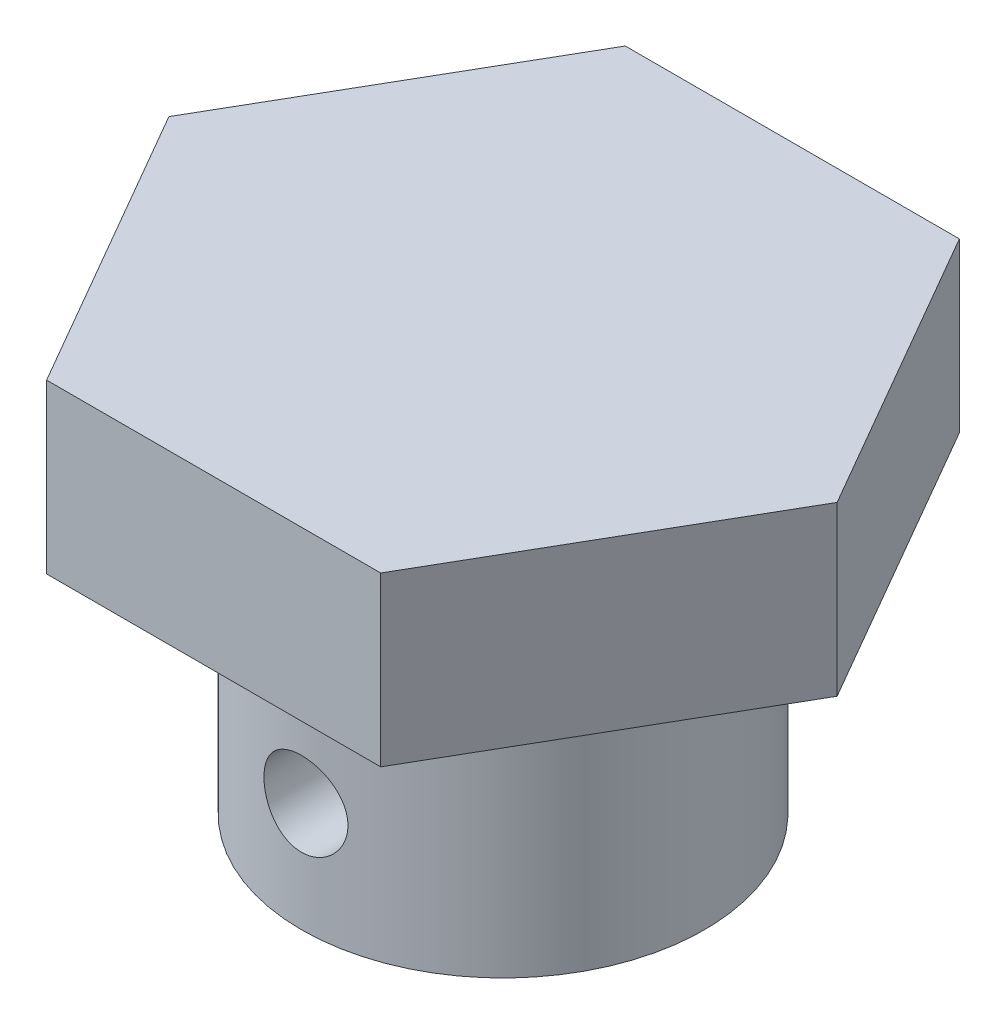
ISO-10303-21;
HEADER;
FILE_DESCRIPTION(('STEP AP214'),'2;1');
FILE_NAME('part.step','',(''),(''),'','','');
FILE_SCHEMA(('AUTOMOTIVE_DESIGN { 1 0 10303 214 1 1 1 1 }'));
ENDSEC;
DATA;
#1=APPLICATION_CONTEXT('core data for automotive mechanical design processes');
#2=APPLICATION_PROTOCOL_DEFINITION('international standard','automotive_design',2000,#1);
#3=PRODUCT_CONTEXT('',#1,'mechanical');
#4=PRODUCT('Part','Part','',(#3));
#5=PRODUCT_RELATED_PRODUCT_CATEGORY('part','',(#4));
#6=PRODUCT_DEFINITION_FORMATION('','',#4);
#7=PRODUCT_DEFINITION_CONTEXT('part definition',#1,'design');
#8=PRODUCT_DEFINITION('design','',#6,#7);
#9=PRODUCT_DEFINITION_SHAPE('','',#8);
#10=(LENGTH_UNIT() NAMED_UNIT(*) SI_UNIT(.MILLI.,.METRE.));
#11=(NAMED_UNIT(*) PLANE_ANGLE_UNIT() SI_UNIT($,.RADIAN.));
#12=(NAMED_UNIT(*) SI_UNIT($,.STERADIAN.) SOLID_ANGLE_UNIT());
#13=UNCERTAINTY_MEASURE_WITH_UNIT(LENGTH_MEASURE(1.E-05),#10,'distance_accuracy_value','');
#14=(GEOMETRIC_REPRESENTATION_CONTEXT(3) GLOBAL_UNCERTAINTY_ASSIGNED_CONTEXT((#13)) GLOBAL_UNIT_ASSIGNED_CONTEXT((#10,
#11,#12)) REPRESENTATION_CONTEXT('',''));
#15=CARTESIAN_POINT('',(0.,0.,0.));
#16=DIRECTION('',(0.,0.,1.));
#17=DIRECTION('',(1.,0.,0.));
#18=AXIS2_PLACEMENT_3D('',#15,#16,#17);
#19=CARTESIAN_POINT('',(0.,0.,0.));
#20=DIRECTION('',(0.,1.,0.));
#21=DIRECTION('',(0.,0.,1.));
#22=AXIS2_PLACEMENT_3D('',#19,#20,#21);
#23=PLANE('',#22);
#24=CARTESIAN_POINT('',(0.,0.,0.));
#25=DIRECTION('',(0.,-1.,0.));
#26=DIRECTION('',(0.,0.,-1.));
#27=AXIS2_PLACEMENT_3D('',#24,#25,#26);
#28=CIRCLE('',#27,4.);
#29=CARTESIAN_POINT('',(0.,0.,-4.));
#30=VERTEX_POINT('',#29);
#31=EDGE_CURVE('E220',#30,#30,#28,.T.);
#32=ORIENTED_EDGE('',*,*,#31,.F.);
#33=EDGE_LOOP('',(#32));
#34=FACE_BOUND('',#33,.T.);
#35=CARTESIAN_POINT('',(0.,0.,0.));
#36=DIRECTION('',(0.,-1.,0.));
#37=DIRECTION('',(0.,0.,-1.));
#38=AXIS2_PLACEMENT_3D('',#35,#36,#37);
#39=CIRCLE('',#38,6.);
#40=CARTESIAN_POINT('',(0.,0.,-6.));
#41=VERTEX_POINT('',#40);
#42=EDGE_CURVE('E145',#41,#41,#39,.T.);
#43=ORIENTED_EDGE('',*,*,#42,.T.);
#44=EDGE_LOOP('',(#43));
#45=FACE_BOUND('',#44,.T.);
#46=ADVANCED_FACE('F33',(#34,#45),#23,.F.);
#47=CARTESIAN_POINT('',(0.,0.,0.));
#48=DIRECTION('',(0.,-1.,0.));
#49=DIRECTION('',(0.,0.,-1.));
#50=AXIS2_PLACEMENT_3D('',#47,#48,#49);
#51=CYLINDRICAL_SURFACE('',#50,6.);
#52=CARTESIAN_POINT('',(0.,4.5,-6.));
#53=CARTESIAN_POINT('',(-0.0694090417016605,4.49999752253077,-5.99999871526651));
#54=CARTESIAN_POINT('',(-0.138848789520875,4.49419933428125,-5.99878328775043));
#55=CARTESIAN_POINT('',(-0.275761316266993,4.47118065046715,-5.99405200990679));
#56=CARTESIAN_POINT('',(-0.343232560128312,4.45395147696307,-5.99053441189248));
#57=CARTESIAN_POINT('',(-0.474209132291341,4.40862954507818,-5.98159109196202));
#58=CARTESIAN_POINT('',(-0.537718336709183,4.38054760400111,-5.97616727052645));
#59=CARTESIAN_POINT('',(-0.659120328605957,4.31435039114382,-5.96399927809859));
#60=CARTESIAN_POINT('',(-0.717013367534325,4.27623556884417,-5.95725516625975));
#61=CARTESIAN_POINT('',(-0.826390324308835,4.19046365980935,-5.9430770002465));
#62=CARTESIAN_POINT('',(-0.877780244162683,4.14268799876492,-5.93563505848531));
#63=CARTESIAN_POINT('',(-0.97187777676939,4.03920534080489,-5.92095657692448));
#64=CARTESIAN_POINT('',(-1.01458467096099,3.98349768812774,-5.91372005416683));
#65=CARTESIAN_POINT('',(-1.09051031677217,3.86504803123384,-5.90019442595308));
#66=CARTESIAN_POINT('',(-1.12363054680651,3.80224161549726,-5.89391545174828));
#67=CARTESIAN_POINT('',(-1.17881119348064,3.67180254822724,-5.8831284065002));
#68=CARTESIAN_POINT('',(-1.20087280167641,3.60417041755746,-5.87862014467568));
#69=CARTESIAN_POINT('',(-1.23300240133737,3.46701476258436,-5.87196500986122));
#70=CARTESIAN_POINT('',(-1.24323597696799,3.39753164066523,-5.86978556855865));
#71=CARTESIAN_POINT('',(-1.25193357655614,3.25780315713737,-5.86793690716491));
#72=CARTESIAN_POINT('',(-1.25039890894687,3.1875578811347,-5.86826740800981));
#73=CARTESIAN_POINT('',(-1.23573719037197,3.04951897202482,-5.87137174319175));
#74=CARTESIAN_POINT('',(-1.2228010523272,2.98170402033879,-5.87410533679901));
#75=CARTESIAN_POINT('',(-1.18600543529945,2.84922849035507,-5.88164437615942));
#76=CARTESIAN_POINT('',(-1.16214539481382,2.78456807439367,-5.88644992841317));
#77=CARTESIAN_POINT('',(-1.10400003213928,2.65969277158402,-5.89763191464102));
#78=CARTESIAN_POINT('',(-1.06964002534237,2.59951370347293,-5.90401953785586));
#79=CARTESIAN_POINT('',(-0.991522699274816,2.48570425573184,-5.91763890010721));
#80=CARTESIAN_POINT('',(-0.947764212262586,2.43207469116403,-5.92487074398537));
#81=CARTESIAN_POINT('',(-0.851074921546781,2.33178603891963,-5.93953730929908));
#82=CARTESIAN_POINT('',(-0.797981433412081,2.28528383110299,-5.94697323199473));
#83=CARTESIAN_POINT('',(-0.684667288611797,2.20181955777103,-5.96108088143001));
#84=CARTESIAN_POINT('',(-0.624446525025764,2.16485763540161,-5.96775259670236));
#85=CARTESIAN_POINT('',(-0.498405541235477,2.10148991846405,-5.97959870942815));
#86=CARTESIAN_POINT('',(-0.432575461926499,2.07510319543288,-5.98477039710258));
#87=CARTESIAN_POINT('',(-0.297284620972155,2.03380829516451,-5.99301338211281));
#88=CARTESIAN_POINT('',(-0.227824338595089,2.0188986067686,-5.99608495596053));
#89=CARTESIAN_POINT('',(-0.088591865700835,2.00120574793212,-5.99974275215455));
#90=CARTESIAN_POINT('',(-0.0188480555261787,1.99820805850575,-6.00037293537579));
#91=CARTESIAN_POINT('',(0.120143798757714,2.00384494996911,-5.99919952252774));
#92=CARTESIAN_POINT('',(0.189391872962257,2.0124788186016,-5.99739607548153));
#93=CARTESIAN_POINT('',(0.324726367119813,2.04095565346954,-5.99158564979184));
#94=CARTESIAN_POINT('',(0.390837192894205,2.06068748538347,-5.98760052868077));
#95=CARTESIAN_POINT('',(0.51881144666133,2.11067786042141,-5.97787227242395));
#96=CARTESIAN_POINT('',(0.580674536336774,2.14093724086598,-5.97212899744579));
#97=CARTESIAN_POINT('',(0.699294306943493,2.21158037823756,-5.95941241490714));
#98=CARTESIAN_POINT('',(0.755973219469833,2.25209192956906,-5.9524239381233));
#99=CARTESIAN_POINT('',(0.861805445886518,2.34191956307627,-5.93802568299709));
#100=CARTESIAN_POINT('',(0.910957877913284,2.39123667551894,-5.93061585542511));
#101=CARTESIAN_POINT('',(1.0011786486518,2.4982555769997,-5.91606024531377));
#102=CARTESIAN_POINT('',(1.04209914600204,2.55608303195528,-5.90892089307501));
#103=CARTESIAN_POINT('',(1.11364719079243,2.67791628421379,-5.89585601015805));
#104=CARTESIAN_POINT('',(1.14427516677864,2.74192182413911,-5.88993042894651));
#105=CARTESIAN_POINT('',(1.19417246443922,2.87396119629823,-5.88001700708041));
#106=CARTESIAN_POINT('',(1.21350309828031,2.94197103716584,-5.87601872784687));
#107=CARTESIAN_POINT('',(1.24044038523407,3.08036655049226,-5.87039184709697));
#108=CARTESIAN_POINT('',(1.24804871544441,3.15075188161944,-5.86876290660367));
#109=CARTESIAN_POINT('',(1.25125926487611,3.29041340099965,-5.86807907308506));
#110=CARTESIAN_POINT('',(1.24709542622725,3.35968407022205,-5.86897402321502));
#111=CARTESIAN_POINT('',(1.22739905314031,3.49651400892022,-5.87312447254927));
#112=CARTESIAN_POINT('',(1.21186662782266,3.56407329481611,-5.87637994909626));
#113=CARTESIAN_POINT('',(1.16998217768585,3.69539777189066,-5.88486132447716));
#114=CARTESIAN_POINT('',(1.14366117568421,3.75917324648693,-5.8900815700793));
#115=CARTESIAN_POINT('',(1.08097457299757,3.88143877602666,-5.90190705738738));
#116=CARTESIAN_POINT('',(1.0446080398303,3.93992833963312,-5.9085124276546));
#117=CARTESIAN_POINT('',(0.962073695342409,4.05112162707944,-5.92251579551146));
#118=CARTESIAN_POINT('',(0.915737890418224,4.10369912456498,-5.92992613868404));
#119=CARTESIAN_POINT('',(0.814924438115333,4.20040949322636,-5.94461839583213));
#120=CARTESIAN_POINT('',(0.760444918832967,4.24454041755148,-5.9519002798488));
#121=CARTESIAN_POINT('',(0.644134427507702,4.32358857318406,-5.96561444547637));
#122=CARTESIAN_POINT('',(0.582225921521347,4.35839367988628,-5.97203596073244));
#123=CARTESIAN_POINT('',(0.453319843998452,4.41705022843002,-5.98319908494092));
#124=CARTESIAN_POINT('',(0.386326781907242,4.44091124718187,-5.98794216182101));
#125=CARTESIAN_POINT('',(0.266015292900104,4.47254027828842,-5.99432499781443));
#126=CARTESIAN_POINT('',(0.213367593727928,4.48281876320886,-5.99644035661395));
#127=CARTESIAN_POINT('',(0.107152674176537,4.49654945427733,-5.99927832789758));
#128=CARTESIAN_POINT('',(0.0535854878488718,4.50000191266719,-6.00000099184586));
#129=CARTESIAN_POINT('',(0.,4.5,-6.));
#130=B_SPLINE_CURVE_WITH_KNOTS('',3,(#52,#53,#54,#55,#56,#57,#58,#59,#60,#61,#62,#63,#64,#65,
#66,#67,#68,#69,#70,#71,#72,#73,#74,#75,#76,#77,#78,#79,#80,#81,#82,#83,#84,#85,#86,#87,#88,#89,
#90,#91,#92,#93,#94,#95,#96,#97,#98,#99,#100,#101,#102,#103,#104,#105,#106,#107,#108,#109,#110,
#111,#112,#113,#114,#115,#116,#117,#118,#119,#120,#121,#122,#123,#124,#125,#126,#127,#128,#129),
.UNSPECIFIED.,.T.,.F.,(4,2,2,2,2,2,2,2,2,2,2,2,2,2,2,2,2,2,2,2,2,2,2,2,2,2,2,2,2,2,2,2,2,2,2,2,
2,2,4),(0.,0.208031045103183,0.416220199906224,0.624202378825441,0.832175241572987,
1.04287526388122,1.25359271551786,1.46640449178548,1.6791933328549,1.88896575169854,
2.09871484767164,2.30501712129059,2.51133000030279,2.71914592416749,2.92698768368034,
3.13889526355465,3.35080602278217,3.56309724499662,3.77536051045771,3.98378339407675,
4.19219351552277,4.39855286632621,4.60492863390932,4.81401583995736,5.02312752564573,
5.23571263829335,5.44828889851308,5.65970050095024,5.87108185414184,6.07829223291037,
6.2855006228136,6.49211731393254,6.69875319081479,6.90919024830308,7.11967575117368,
7.33258864398255,7.54531486464972,7.70592588477279,7.8665309697339),.UNSPECIFIED.);
#131=CARTESIAN_POINT('',(0.,4.5,-6.));
#132=VERTEX_POINT('',#131);
#133=EDGE_CURVE('E37',#132,#132,#130,.T.);
#134=ORIENTED_EDGE('',*,*,#133,.T.);
#135=EDGE_LOOP('',(#134));
#136=FACE_BOUND('',#135,.T.);
#137=CARTESIAN_POINT('',(1.25,3.25,5.86834729715275));
#138=CARTESIAN_POINT('',(1.24999750877599,3.18060938484897,5.86834869213645));
#139=CARTESIAN_POINT('',(1.24420229433948,3.11118802798478,5.86959145924544));
#140=CARTESIAN_POINT('',(1.22119649233779,2.97431368268275,5.87442015581798));
#141=CARTESIAN_POINT('',(1.20397715440342,2.90686224449358,5.87800788138388));
#142=CARTESIAN_POINT('',(1.1586839750723,2.77592762716513,5.8871029296193));
#143=CARTESIAN_POINT('',(1.13062141248932,2.7124404040082,5.89260825706945));
#144=CARTESIAN_POINT('',(1.06446988601732,2.5910755003544,5.90491581335741));
#145=CARTESIAN_POINT('',(1.0263813273582,2.53319759326998,5.91171798977622));
#146=CARTESIAN_POINT('',(0.940636399466082,2.42380462484654,5.92596934661468));
#147=CARTESIAN_POINT('',(0.892855554869668,2.37238810637353,5.93342614373039));
#148=CARTESIAN_POINT('',(0.789351223880636,2.2782389313519,5.94807966802575));
#149=CARTESIAN_POINT('',(0.733627155456002,2.23550691170856,5.95527637609915));
#150=CARTESIAN_POINT('',(0.615162052999588,2.15955411191714,5.96868135118848));
#151=CARTESIAN_POINT('',(0.552359428204941,2.12642747353674,5.97487958631242));
#152=CARTESIAN_POINT('',(0.42192855100672,2.07123394714022,5.98550347343302));
#153=CARTESIAN_POINT('',(0.354300789950591,2.04916593484647,5.98992930561222));
#154=CARTESIAN_POINT('',(0.217162904200503,2.01702423888253,5.99645589892179));
#155=CARTESIAN_POINT('',(0.147693380916358,2.00678398280484,5.99858891959926));
#156=CARTESIAN_POINT('',(0.00799184883952483,1.99806830424298,6.00040112580612));
#157=CARTESIAN_POINT('',(-0.0622400797368379,1.9995916558069,6.0000805670369));
#158=CARTESIAN_POINT('',(-0.200326586199571,2.01423460095674,5.99704658090511));
#159=CARTESIAN_POINT('',(-0.268201128726474,2.02717471895812,5.99437018956584));
#160=CARTESIAN_POINT('',(-0.400793746289751,2.06399862533131,5.98696720898885));
#161=CARTESIAN_POINT('',(-0.465511687511021,2.08788287720308,5.98224053291904));
#162=CARTESIAN_POINT('',(-0.590460005384682,2.1460800521255,5.97120767323924));
#163=CARTESIAN_POINT('',(-0.650657134981649,2.18046229420966,5.96489104125346));
#164=CARTESIAN_POINT('',(-0.764493456510647,2.25862800284042,5.95137300440189));
#165=CARTESIAN_POINT('',(-0.818131831816417,2.30241263820613,5.94417148958325));
#166=CARTESIAN_POINT('',(-0.918394203276911,2.39912162489106,5.92951700233276));
#167=CARTESIAN_POINT('',(-0.964866487494793,2.45220305998195,5.92206184975925));
#168=CARTESIAN_POINT('',(-1.04827597240488,2.5654820489948,5.90786872648996));
#169=CARTESIAN_POINT('',(-1.0852129606998,2.62567976138723,5.9011307717716));
#170=CARTESIAN_POINT('',(-1.14856217138454,2.7517122548288,5.88912998409156));
#171=CARTESIAN_POINT('',(-1.17494805489727,2.81756065069343,5.88387085232125));
#172=CARTESIAN_POINT('',(-1.21623577538673,2.95289161936939,5.8754760641036));
#173=CARTESIAN_POINT('',(-1.23113924882348,3.02237367280809,5.87234010507182));
#174=CARTESIAN_POINT('',(-1.24880863867017,3.16161970631891,5.86860783239132));
#175=CARTESIAN_POINT('',(-1.25179442917998,3.23135458453703,5.86796551863474));
#176=CARTESIAN_POINT('',(-1.24613693439294,3.37032581154014,5.86916952018704));
#177=CARTESIAN_POINT('',(-1.23749436857862,3.43956219090233,5.87101568152624));
#178=CARTESIAN_POINT('',(-1.20901558325484,3.57482051605812,5.87694538226166));
#179=CARTESIAN_POINT('',(-1.18929841376871,3.64086866717883,5.88100511282997));
#180=CARTESIAN_POINT('',(-1.13935810860919,3.7687239894416,5.8908833850312));
#181=CARTESIAN_POINT('',(-1.10913404556146,3.8305307856504,5.89670208191057));
#182=CARTESIAN_POINT('',(-1.03854598181484,3.94910644121623,5.90954501937191));
#183=CARTESIAN_POINT('',(-0.998045327353961,4.00579220446617,5.91658506648323));
#184=CARTESIAN_POINT('',(-0.908234440569878,4.11164324915506,5.93103483993908));
#185=CARTESIAN_POINT('',(-0.858923220505172,4.16080768623923,5.93844460766532));
#186=CARTESIAN_POINT('',(-0.751900450843339,4.25106271309716,5.95294924316736));
#187=CARTESIAN_POINT('',(-0.694061907614551,4.29200409502638,5.9600367471991));
#188=CARTESIAN_POINT('',(-0.572200102216359,4.36358875208798,5.97296708772407));
#189=CARTESIAN_POINT('',(-0.508177113476881,4.39423248223745,5.97880997920818));
#190=CARTESIAN_POINT('',(-0.376142117847919,4.44413867931734,5.98856148270679));
#191=CARTESIAN_POINT('',(-0.308156710970195,4.46346916554434,5.99248163136497));
#192=CARTESIAN_POINT('',(-0.169813400503473,4.49041440400809,5.99799561410226));
#193=CARTESIAN_POINT('',(-0.0994558094616956,4.49803069353273,5.99958975342889));
#194=CARTESIAN_POINT('',(0.0402133434703384,4.50126762204851,6.00026408056941));
#195=CARTESIAN_POINT('',(0.109519592177921,4.49711189999473,5.99939113754811));
#196=CARTESIAN_POINT('',(0.246422870373551,4.47741936134707,5.99532874094472));
#197=CARTESIAN_POINT('',(0.314019925202702,4.46188271359323,5.99213932172839));
#198=CARTESIAN_POINT('',(0.445431965492051,4.41997220535144,5.98380460077544));
#199=CARTESIAN_POINT('',(0.509256550004522,4.39362733614689,5.97866453407556));
#200=CARTESIAN_POINT('',(0.63161056722074,4.330877602268,5.96697995347704));
#201=CARTESIAN_POINT('',(0.690139538279509,4.29447186165686,5.96043531730246));
#202=CARTESIAN_POINT('',(0.801340321298259,4.21189033200669,5.94651596786386));
#203=CARTESIAN_POINT('',(0.853892633615924,4.1655557119433,5.93912880302851));
#204=CARTESIAN_POINT('',(0.950552741980383,4.06475549900292,5.9244278681135));
#205=CARTESIAN_POINT('',(0.99465852157123,4.01028797005157,5.91711411595368));
#206=CARTESIAN_POINT('',(1.07367451852767,3.89399089756656,5.90329191643327));
#207=CARTESIAN_POINT('',(1.10846928126994,3.8320815885379,5.89679406702551));
#208=CARTESIAN_POINT('',(1.16710627925306,3.70317484391673,5.88547039658063));
#209=CARTESIAN_POINT('',(1.1909581629246,3.63618195154699,5.88064310352601));
#210=CARTESIAN_POINT('',(1.22256554131861,3.51589371843157,5.87414004405196));
#211=CARTESIAN_POINT('',(1.2328344900567,3.46327046340695,5.87198163591589));
#212=CARTESIAN_POINT('',(1.24655254358404,3.35710421947899,5.86908475266778));
#213=CARTESIAN_POINT('',(1.25000192292741,3.30356126768996,5.86834622039193));
#214=CARTESIAN_POINT('',(1.25,3.25,5.86834729715275));
#215=B_SPLINE_CURVE_WITH_KNOTS('',3,(#137,#138,#139,#140,#141,#142,#143,#144,#145,#146,#147,
#148,#149,#150,#151,#152,#153,#154,#155,#156,#157,#158,#159,#160,#161,#162,#163,#164,#165,#166,
#167,#168,#169,#170,#171,#172,#173,#174,#175,#176,#177,#178,#179,#180,#181,#182,#183,#184,#185,
#186,#187,#188,#189,#190,#191,#192,#193,#194,#195,#196,#197,#198,#199,#200,#201,#202,#203,#204,
#205,#206,#207,#208,#209,#210,#211,#212,#213,#214),.UNSPECIFIED.,.T.,.F.,(4,2,2,2,2,2,2,2,2,2,2,
2,2,2,2,2,2,2,2,2,2,2,2,2,2,2,2,2,2,2,2,2,2,2,2,2,2,2,4),(0.,0.207975654071269,0.41611079241747,
0.624030014802728,0.831940834815789,1.04271333467885,1.25350128663873,1.46629026266843,
1.67905760106933,1.88879048859264,2.09850151896338,2.30497341416461,2.5114540545587,
2.71932871977949,2.92722924104259,3.13905862244913,3.35089272191627,3.56325237332487,
3.77558175387596,3.98397516009791,4.19235567296523,4.39853786231922,4.6047382546403,
4.8138391793465,5.02296356082185,5.23559458753343,5.44821621759039,5.65954599648533,
5.8708480395958,6.07816293922644,6.2854747633298,6.492234105851,6.69901145528172,
6.90938318978572,7.11980508427534,7.33272651358122,7.54545984571987,7.70599867585768,
7.8665310426116),.UNSPECIFIED.);
#216=CARTESIAN_POINT('',(1.25,3.25,5.86834729715275));
#217=VERTEX_POINT('',#216);
#218=EDGE_CURVE('E11',#217,#217,#215,.T.);
#219=ORIENTED_EDGE('',*,*,#218,.T.);
#220=EDGE_LOOP('',(#219));
#221=FACE_BOUND('',#220,.T.);
#222=CARTESIAN_POINT('',(0.,6.5,0.));
#223=DIRECTION('',(0.,1.,0.));
#224=DIRECTION('',(0.,0.,1.));
#225=AXIS2_PLACEMENT_3D('',#222,#223,#224);
#226=CIRCLE('',#225,6.);
#227=CARTESIAN_POINT('',(0.,6.5,6.));
#228=VERTEX_POINT('',#227);
#229=EDGE_CURVE('E148',#228,#228,#226,.F.);
#230=ORIENTED_EDGE('',*,*,#229,.T.);
#231=EDGE_LOOP('',(#230));
#232=FACE_BOUND('',#231,.T.);
#233=ORIENTED_EDGE('',*,*,#42,.F.);
#234=EDGE_LOOP('',(#233));
#235=FACE_BOUND('',#234,.T.);
#236=ADVANCED_FACE('F155',(#136,#221,#232,#235),#51,.T.);
#237=CARTESIAN_POINT('',(4.975,13.,-8.61695276765516));
#238=DIRECTION('',(0.,0.,1.));
#239=DIRECTION('',(1.,0.,0.));
#240=AXIS2_PLACEMENT_3D('',#237,#238,#239);
#241=PLANE('',#240);
#242=DIRECTION('',(-1.,0.,0.));
#243=VECTOR('',#242,1.);
#244=CARTESIAN_POINT('',(4.975,8.,-8.61695276765516));
#245=LINE('',#244,#243);
#246=CARTESIAN_POINT('',(4.975,8.,-8.61695276765516));
#247=VERTEX_POINT('',#246);
#248=CARTESIAN_POINT('',(-4.975,8.,-8.61695276765516));
#249=VERTEX_POINT('',#248);
#250=EDGE_CURVE('E125',#247,#249,#245,.T.);
#251=ORIENTED_EDGE('',*,*,#250,.T.);
#252=DIRECTION('',(0.,-1.,0.));
#253=VECTOR('',#252,1.);
#254=CARTESIAN_POINT('',(-4.975,13.,-8.61695276765516));
#255=LINE('',#254,#253);
#256=CARTESIAN_POINT('',(-4.975,13.,-8.61695276765516));
#257=VERTEX_POINT('',#256);
#258=EDGE_CURVE('E143',#257,#249,#255,.T.);
#259=ORIENTED_EDGE('',*,*,#258,.F.);
#260=DIRECTION('',(-1.,0.,0.));
#261=VECTOR('',#260,1.);
#262=CARTESIAN_POINT('',(4.975,13.,-8.61695276765516));
#263=LINE('',#262,#261);
#264=CARTESIAN_POINT('',(4.975,13.,-8.61695276765516));
#265=VERTEX_POINT('',#264);
#266=EDGE_CURVE('E136',#265,#257,#263,.T.);
#267=ORIENTED_EDGE('',*,*,#266,.F.);
#268=DIRECTION('',(0.,-1.,0.));
#269=VECTOR('',#268,1.);
#270=CARTESIAN_POINT('',(4.975,13.,-8.61695276765516));
#271=LINE('',#270,#269);
#272=EDGE_CURVE('E121',#265,#247,#271,.T.);
#273=ORIENTED_EDGE('',*,*,#272,.T.);
#274=EDGE_LOOP('',(#251,#259,#267,#273));
#275=FACE_BOUND('',#274,.T.);
#276=ADVANCED_FACE('F206',(#275),#241,.F.);
#277=CARTESIAN_POINT('',(-4.975,13.,-8.61695276765516));
#278=DIRECTION('',(0.866025403784439,0.,0.5));
#279=DIRECTION('',(0.5,0.,-0.866025403784439));
#280=AXIS2_PLACEMENT_3D('',#277,#278,#279);
#281=PLANE('',#280);
#282=DIRECTION('',(-0.5,0.,0.866025403784439));
#283=VECTOR('',#282,1.);
#284=CARTESIAN_POINT('',(-4.975,8.,-8.61695276765516));
#285=LINE('',#284,#283);
#286=CARTESIAN_POINT('',(-9.95,8.,0.));
#287=VERTEX_POINT('',#286);
#288=EDGE_CURVE('E128',#249,#287,#285,.T.);
#289=ORIENTED_EDGE('',*,*,#288,.T.);
#290=DIRECTION('',(0.,-1.,0.));
#291=VECTOR('',#290,1.);
#292=CARTESIAN_POINT('',(-9.95,13.,0.));
#293=LINE('',#292,#291);
#294=CARTESIAN_POINT('',(-9.95,13.,0.));
#295=VERTEX_POINT('',#294);
#296=EDGE_CURVE('E140',#295,#287,#293,.T.);
#297=ORIENTED_EDGE('',*,*,#296,.F.);
#298=DIRECTION('',(-0.5,0.,0.866025403784439));
#299=VECTOR('',#298,1.);
#300=CARTESIAN_POINT('',(-4.975,13.,-8.61695276765516));
#301=LINE('',#300,#299);
#302=EDGE_CURVE('E94',#257,#295,#301,.T.);
#303=ORIENTED_EDGE('',*,*,#302,.F.);
#304=ORIENTED_EDGE('',*,*,#258,.T.);
#305=EDGE_LOOP('',(#289,#297,#303,#304));
#306=FACE_BOUND('',#305,.T.);
#307=ADVANCED_FACE('F203',(#306),#281,.F.);
#308=CARTESIAN_POINT('',(-9.95,13.,0.));
#309=DIRECTION('',(0.866025403784439,0.,-0.5));
#310=DIRECTION('',(-0.5,0.,-0.866025403784439));
#311=AXIS2_PLACEMENT_3D('',#308,#309,#310);
#312=PLANE('',#311);
#313=DIRECTION('',(0.5,0.,0.866025403784439));
#314=VECTOR('',#313,1.);
#315=CARTESIAN_POINT('',(-9.95,8.,0.));
#316=LINE('',#315,#314);
#317=CARTESIAN_POINT('',(-4.975,8.,8.61695276765516));
#318=VERTEX_POINT('',#317);
#319=EDGE_CURVE('E131',#287,#318,#316,.T.);
#320=ORIENTED_EDGE('',*,*,#319,.T.);
#321=DIRECTION('',(0.,-1.,0.));
#322=VECTOR('',#321,1.);
#323=CARTESIAN_POINT('',(-4.975,13.,8.61695276765516));
#324=LINE('',#323,#322);
#325=CARTESIAN_POINT('',(-4.975,13.,8.61695276765516));
#326=VERTEX_POINT('',#325);
#327=EDGE_CURVE('E116',#326,#318,#324,.T.);
#328=ORIENTED_EDGE('',*,*,#327,.F.);
#329=DIRECTION('',(0.5,0.,0.866025403784439));
#330=VECTOR('',#329,1.);
#331=CARTESIAN_POINT('',(-9.95,13.,0.));
#332=LINE('',#331,#330);
#333=EDGE_CURVE('E107',#295,#326,#332,.T.);
#334=ORIENTED_EDGE('',*,*,#333,.F.);
#335=ORIENTED_EDGE('',*,*,#296,.T.);
#336=EDGE_LOOP('',(#320,#328,#334,#335));
#337=FACE_BOUND('',#336,.T.);
#338=ADVANCED_FACE('F200',(#337),#312,.F.);
#339=CARTESIAN_POINT('',(-4.975,13.,8.61695276765516));
#340=DIRECTION('',(0.,0.,-1.));
#341=DIRECTION('',(-1.,0.,0.));
#342=AXIS2_PLACEMENT_3D('',#339,#340,#341);
#343=PLANE('',#342);
#344=DIRECTION('',(1.,0.,0.));
#345=VECTOR('',#344,1.);
#346=CARTESIAN_POINT('',(-4.975,8.,8.61695276765516));
#347=LINE('',#346,#345);
#348=CARTESIAN_POINT('',(4.975,8.,8.61695276765517));
#349=VERTEX_POINT('',#348);
#350=EDGE_CURVE('E115',#318,#349,#347,.T.);
#351=ORIENTED_EDGE('',*,*,#350,.T.);
#352=DIRECTION('',(0.,-1.,0.));
#353=VECTOR('',#352,1.);
#354=CARTESIAN_POINT('',(4.975,13.,8.61695276765517));
#355=LINE('',#354,#353);
#356=CARTESIAN_POINT('',(4.975,13.,8.61695276765517));
#357=VERTEX_POINT('',#356);
#358=EDGE_CURVE('E112',#357,#349,#355,.T.);
#359=ORIENTED_EDGE('',*,*,#358,.F.);
#360=DIRECTION('',(1.,0.,0.));
#361=VECTOR('',#360,1.);
#362=CARTESIAN_POINT('',(-4.975,13.,8.61695276765516));
#363=LINE('',#362,#361);
#364=EDGE_CURVE('E101',#326,#357,#363,.T.);
#365=ORIENTED_EDGE('',*,*,#364,.F.);
#366=ORIENTED_EDGE('',*,*,#327,.T.);
#367=EDGE_LOOP('',(#351,#359,#365,#366));
#368=FACE_BOUND('',#367,.T.);
#369=ADVANCED_FACE('F113',(#368),#343,.F.);
#370=CARTESIAN_POINT('',(4.975,13.,8.61695276765517));
#371=DIRECTION('',(-0.866025403784439,0.,-0.5));
#372=DIRECTION('',(-0.5,0.,0.866025403784439));
#373=AXIS2_PLACEMENT_3D('',#370,#371,#372);
#374=PLANE('',#373);
#375=DIRECTION('',(0.5,0.,-0.866025403784439));
#376=VECTOR('',#375,1.);
#377=CARTESIAN_POINT('',(4.975,8.,8.61695276765517));
#378=LINE('',#377,#376);
#379=CARTESIAN_POINT('',(9.95,8.,0.));
#380=VERTEX_POINT('',#379);
#381=EDGE_CURVE('E79',#349,#380,#378,.T.);
#382=ORIENTED_EDGE('',*,*,#381,.T.);
#383=DIRECTION('',(0.,-1.,0.));
#384=VECTOR('',#383,1.);
#385=CARTESIAN_POINT('',(9.95,13.,0.));
#386=LINE('',#385,#384);
#387=CARTESIAN_POINT('',(9.95,13.,0.));
#388=VERTEX_POINT('',#387);
#389=EDGE_CURVE('E117',#388,#380,#386,.T.);
#390=ORIENTED_EDGE('',*,*,#389,.F.);
#391=DIRECTION('',(0.5,0.,-0.866025403784439));
#392=VECTOR('',#391,1.);
#393=CARTESIAN_POINT('',(4.975,13.,8.61695276765517));
#394=LINE('',#393,#392);
#395=EDGE_CURVE('E105',#357,#388,#394,.T.);
#396=ORIENTED_EDGE('',*,*,#395,.F.);
#397=ORIENTED_EDGE('',*,*,#358,.T.);
#398=EDGE_LOOP('',(#382,#390,#396,#397));
#399=FACE_BOUND('',#398,.T.);
#400=ADVANCED_FACE('F119',(#399),#374,.F.);
#401=CARTESIAN_POINT('',(9.95,13.,0.));
#402=DIRECTION('',(-0.866025403784438,0.,0.5));
#403=DIRECTION('',(0.5,0.,0.866025403784439));
#404=AXIS2_PLACEMENT_3D('',#401,#402,#403);
#405=PLANE('',#404);
#406=DIRECTION('',(-0.5,0.,-0.866025403784438));
#407=VECTOR('',#406,1.);
#408=CARTESIAN_POINT('',(9.95,8.,0.));
#409=LINE('',#408,#407);
#410=EDGE_CURVE('E85',#380,#247,#409,.T.);
#411=ORIENTED_EDGE('',*,*,#410,.T.);
#412=ORIENTED_EDGE('',*,*,#272,.F.);
#413=DIRECTION('',(-0.5,0.,-0.866025403784438));
#414=VECTOR('',#413,1.);
#415=CARTESIAN_POINT('',(9.95,13.,0.));
#416=LINE('',#415,#414);
#417=EDGE_CURVE('E56',#388,#265,#416,.T.);
#418=ORIENTED_EDGE('',*,*,#417,.F.);
#419=ORIENTED_EDGE('',*,*,#389,.T.);
#420=EDGE_LOOP('',(#411,#412,#418,#419));
#421=FACE_BOUND('',#420,.T.);
#422=ADVANCED_FACE('F190',(#421),#405,.F.);
#423=CARTESIAN_POINT('',(0.,13.,0.));
#424=DIRECTION('',(0.,1.,0.));
#425=DIRECTION('',(0.,0.,1.));
#426=AXIS2_PLACEMENT_3D('',#423,#424,#425);
#427=PLANE('',#426);
#428=ORIENTED_EDGE('',*,*,#266,.T.);
#429=ORIENTED_EDGE('',*,*,#302,.T.);
#430=ORIENTED_EDGE('',*,*,#333,.T.);
#431=ORIENTED_EDGE('',*,*,#364,.T.);
#432=ORIENTED_EDGE('',*,*,#395,.T.);
#433=ORIENTED_EDGE('',*,*,#417,.T.);
#434=EDGE_LOOP('',(#428,#429,#430,#431,#432,#433));
#435=FACE_BOUND('',#434,.T.);
#436=ADVANCED_FACE('F103',(#435),#427,.T.);
#437=CARTESIAN_POINT('',(0.,8.,0.));
#438=DIRECTION('',(0.,1.,0.));
#439=DIRECTION('',(0.,0.,1.));
#440=AXIS2_PLACEMENT_3D('',#437,#438,#439);
#441=PLANE('',#440);
#442=CARTESIAN_POINT('',(0.,8.,0.));
#443=DIRECTION('',(0.,1.,0.));
#444=DIRECTION('',(0.,0.,1.));
#445=AXIS2_PLACEMENT_3D('',#442,#443,#444);
#446=CIRCLE('',#445,7.5);
#447=CARTESIAN_POINT('',(0.,8.,7.5));
#448=VERTEX_POINT('',#447);
#449=EDGE_CURVE('E48',#448,#448,#446,.T.);
#450=ORIENTED_EDGE('',*,*,#449,.T.);
#451=EDGE_LOOP('',(#450));
#452=FACE_BOUND('',#451,.T.);
#453=ORIENTED_EDGE('',*,*,#250,.F.);
#454=ORIENTED_EDGE('',*,*,#410,.F.);
#455=ORIENTED_EDGE('',*,*,#381,.F.);
#456=ORIENTED_EDGE('',*,*,#350,.F.);
#457=ORIENTED_EDGE('',*,*,#319,.F.);
#458=ORIENTED_EDGE('',*,*,#288,.F.);
#459=EDGE_LOOP('',(#453,#454,#455,#456,#457,#458));
#460=FACE_BOUND('',#459,.T.);
#461=ADVANCED_FACE('F189',(#452,#460),#441,.F.);
#462=CARTESIAN_POINT('',(0.,6.5,0.));
#463=DIRECTION('',(0.,1.,0.));
#464=DIRECTION('',(0.,0.,1.));
#465=AXIS2_PLACEMENT_3D('',#462,#463,#464);
#466=TOROIDAL_SURFACE('',#465,7.5,1.5);
#467=ORIENTED_EDGE('',*,*,#449,.F.);
#468=EDGE_LOOP('',(#467));
#469=FACE_BOUND('',#468,.T.);
#470=ORIENTED_EDGE('',*,*,#229,.F.);
#471=EDGE_LOOP('',(#470));
#472=FACE_BOUND('',#471,.T.);
#473=ADVANCED_FACE('F35',(#469,#472),#466,.F.);
#474=CARTESIAN_POINT('',(0.,10.,0.));
#475=DIRECTION('',(0.,-1.,0.));
#476=DIRECTION('',(0.,0.,-1.));
#477=AXIS2_PLACEMENT_3D('',#474,#475,#476);
#478=CYLINDRICAL_SURFACE('',#477,4.);
#479=CARTESIAN_POINT('',(0.,4.5,-4.));
#480=CARTESIAN_POINT('',(0.0684391851745463,4.49999955341242,-3.99999965877989));
#481=CARTESIAN_POINT('',(0.136883052502859,4.49436077305554,-3.99822694984841));
#482=CARTESIAN_POINT('',(0.271769209588448,4.47201375846076,-3.99132894088807));
#483=CARTESIAN_POINT('',(0.338211042725906,4.45530301863564,-3.9862028819986));
#484=CARTESIAN_POINT('',(0.467128543650805,4.41143062880426,-3.97315815697909));
#485=CARTESIAN_POINT('',(0.529610176985803,4.38428515534703,-3.96524381499025));
#486=CARTESIAN_POINT('',(0.649134802346459,4.32038268232167,-3.94743969161093));
#487=CARTESIAN_POINT('',(0.706176935444884,4.28362416821941,-3.93754959899905));
#488=CARTESIAN_POINT('',(0.814965334952279,4.20034400798264,-3.91650213740282));
#489=CARTESIAN_POINT('',(0.866520028156658,4.15357911493893,-3.90531715926989));
#490=CARTESIAN_POINT('',(0.961197382036991,4.05213160758645,-3.88310046374209));
#491=CARTESIAN_POINT('',(1.00431847289869,3.99744752250545,-3.87206877523457));
#492=CARTESIAN_POINT('',(1.08194336483113,3.88005543619192,-3.85111144698172));
#493=CARTESIAN_POINT('',(1.11620784150129,3.81718252247278,-3.84121988301796));
#494=CARTESIAN_POINT('',(1.17359741076671,3.68620768501813,-3.82407801799234));
#495=CARTESIAN_POINT('',(1.19672543771944,3.61810714420607,-3.81682702128689));
#496=CARTESIAN_POINT('',(1.23048459930033,3.48077192254794,-3.80607606984501));
#497=CARTESIAN_POINT('',(1.24147110007864,3.41163315636115,-3.80246972929508));
#498=CARTESIAN_POINT('',(1.25174555036988,3.27240688108811,-3.7991005514095));
#499=CARTESIAN_POINT('',(1.25103660995772,3.20231962917834,-3.79933669227334));
#500=CARTESIAN_POINT('',(1.23821824732739,3.06612553973102,-3.80353189075438));
#501=CARTESIAN_POINT('',(1.22656057869383,2.99997087413844,-3.80734341745949));
#502=CARTESIAN_POINT('',(1.19290813355626,2.87060784346265,-3.81802025652489));
#503=CARTESIAN_POINT('',(1.1709122584455,2.8073997922912,-3.82488589343115));
#504=CARTESIAN_POINT('',(1.11688874681277,2.68464805556737,-3.84101044014297));
#505=CARTESIAN_POINT('',(1.08471925662082,2.62517138930802,-3.85030284660825));
#506=CARTESIAN_POINT('',(1.01136020737848,2.51231223212088,-3.8702185658007));
#507=CARTESIAN_POINT('',(0.970168305215771,2.45893132974629,-3.88084222394551));
#508=CARTESIAN_POINT('',(0.877716954182122,2.35722505658301,-3.90281527800493));
#509=CARTESIAN_POINT('',(0.826084570592816,2.30924044222032,-3.91417569605696));
#510=CARTESIAN_POINT('',(0.715364408095529,2.22252810642032,-3.9359157075958));
#511=CARTESIAN_POINT('',(0.656276077349019,2.18380107078079,-3.94629522838372));
#512=CARTESIAN_POINT('',(0.531664610465453,2.11647231139873,-3.96501294890191));
#513=CARTESIAN_POINT('',(0.466094906919279,2.08795186453603,-3.97333460648208));
#514=CARTESIAN_POINT('',(0.330767977782644,2.04244699914844,-3.98687955828554));
#515=CARTESIAN_POINT('',(0.261012030724608,2.02545907776161,-3.99210379325151));
#516=CARTESIAN_POINT('',(0.122185157290344,2.00408195742102,-3.99871389395014));
#517=CARTESIAN_POINT('',(0.053191848788842,1.99923145640648,-4.00024022895439));
#518=CARTESIAN_POINT('',(-0.0846303057325848,2.00096622663733,-3.99969799730981));
#519=CARTESIAN_POINT('',(-0.153459174306505,2.00754982732261,-3.99762995581125));
#520=CARTESIAN_POINT('',(-0.287219332975851,2.0315955926064,-3.99022363769772));
#521=CARTESIAN_POINT('',(-0.352204978420947,2.04878326761252,-3.98496793110725));
#522=CARTESIAN_POINT('',(-0.478351928861365,2.09321435236669,-3.97180121379252));
#523=CARTESIAN_POINT('',(-0.539512760449015,2.12045900402491,-3.96388987514203));
#524=CARTESIAN_POINT('',(-0.65793240667223,2.1849732165488,-3.94598542759568));
#525=CARTESIAN_POINT('',(-0.715059739787954,2.22247098749722,-3.9359462681821));
#526=CARTESIAN_POINT('',(-0.822365850960094,2.30615321011702,-3.91493410002887));
#527=CARTESIAN_POINT('',(-0.872542738043335,2.35234001774312,-3.90396083845862));
#528=CARTESIAN_POINT('',(-0.966587462919655,2.45425889005369,-3.88176994885247));
#529=CARTESIAN_POINT('',(-1.01012652339773,2.51029666374526,-3.87055986714446));
#530=CARTESIAN_POINT('',(-1.08721250244909,2.62912661637074,-3.84961947087602));
#531=CARTESIAN_POINT('',(-1.12075957972524,2.69191868800443,-3.839889132814));
#532=CARTESIAN_POINT('',(-1.17670083481141,2.82234517288586,-3.82311782360754));
#533=CARTESIAN_POINT('',(-1.19913819558885,2.8899596495047,-3.81606646468027));
#534=CARTESIAN_POINT('',(-1.23222894320963,3.0282724933238,-3.80551170941212));
#535=CARTESIAN_POINT('',(-1.2428868141461,3.09896967637132,-3.80200696302675));
#536=CARTESIAN_POINT('',(-1.2517940615754,3.23800408755424,-3.79908292712495));
#537=CARTESIAN_POINT('',(-1.25058279621957,3.30630345381293,-3.79948604683077));
#538=CARTESIAN_POINT('',(-1.23708818129474,3.44167458491918,-3.80390090472383));
#539=CARTESIAN_POINT('',(-1.22480534822559,3.508746406884,-3.80791247457319));
#540=CARTESIAN_POINT('',(-1.18987729913378,3.63879403960178,-3.81896814158112));
#541=CARTESIAN_POINT('',(-1.16738642405944,3.70181544109601,-3.82596698183474));
#542=CARTESIAN_POINT('',(-1.11280227335064,3.82324041353135,-3.84219704261348));
#543=CARTESIAN_POINT('',(-1.08070704444254,3.88164304207768,-3.85142871716522));
#544=CARTESIAN_POINT('',(-1.00635675013475,3.99464597044056,-3.8715348703158));
#545=CARTESIAN_POINT('',(-0.963753335241271,4.04900812950044,-3.88245948922441));
#546=CARTESIAN_POINT('',(-0.870208996404846,4.14998632811179,-3.90448998821726));
#547=CARTESIAN_POINT('',(-0.819265842344401,4.196600288991,-3.91559591606795));
#548=CARTESIAN_POINT('',(-0.708486662823331,4.28228253836299,-3.93717271952329));
#549=CARTESIAN_POINT('',(-0.648414574487379,4.32105473644997,-3.94761101730634));
#550=CARTESIAN_POINT('',(-0.522279138013653,4.38789891513944,-3.96626769296916));
#551=CARTESIAN_POINT('',(-0.456218157795448,4.41597510214183,-3.97448694315832));
#552=CARTESIAN_POINT('',(-0.325747635373976,4.45859136760846,-3.98720650733461));
#553=CARTESIAN_POINT('',(-0.261670337112545,4.47407486730534,-3.99196240806139));
#554=CARTESIAN_POINT('',(-0.131729895440247,4.49477835996771,-3.99835900340486));
#555=CARTESIAN_POINT('',(-0.0658671161396743,4.500000429804,-4.00000032839644));
#556=CARTESIAN_POINT('',(0.,4.5,-4.));
#557=B_SPLINE_CURVE_WITH_KNOTS('',3,(#479,#480,#481,#482,#483,#484,#485,#486,#487,#488,#489,
#490,#491,#492,#493,#494,#495,#496,#497,#498,#499,#500,#501,#502,#503,#504,#505,#506,#507,#508,
#509,#510,#511,#512,#513,#514,#515,#516,#517,#518,#519,#520,#521,#522,#523,#524,#525,#526,#527,
#528,#529,#530,#531,#532,#533,#534,#535,#536,#537,#538,#539,#540,#541,#542,#543,#544,#545,#546,
#547,#548,#549,#550,#551,#552,#553,#554,#555,#556),.UNSPECIFIED.,.T.,.F.,(4,2,2,2,2,2,2,2,2,2,2,
2,2,2,2,2,2,2,2,2,2,2,2,2,2,2,2,2,2,2,2,2,2,2,2,2,2,2,4),(0.,0.205075449432509,
0.410197323349065,0.615002479202435,0.81983992155839,1.03037822195158,1.24095567431276,
1.45673771247494,1.67246286279527,1.88169150167209,2.09086450295138,2.29176917422169,
2.49269519979062,2.69655642720545,2.90047066010358,3.11366747279599,3.32688007413302,
3.54175460689769,3.75656384494553,3.96307568548237,4.16955735649362,4.37090626722871,
4.57228005034499,4.77856324738342,4.98490245709258,5.19941778713139,5.41392970983711,
5.6276011575103,5.84119123892429,6.04512203476052,6.24904331751083,6.4499791339667,
6.65095584330172,6.8597951400636,7.06869037373339,7.28440668126411,7.50003806666336,
7.69744636651539,7.89481470763046),.UNSPECIFIED.);
#558=CARTESIAN_POINT('',(0.,4.5,-4.));
#559=VERTEX_POINT('',#558);
#560=EDGE_CURVE('E176',#559,#559,#557,.T.);
#561=ORIENTED_EDGE('',*,*,#560,.T.);
#562=EDGE_LOOP('',(#561));
#563=FACE_BOUND('',#562,.T.);
#564=CARTESIAN_POINT('',(1.25,3.25,3.79967103839267));
#565=CARTESIAN_POINT('',(1.24999953780047,3.31834703610934,3.79967145961936));
#566=CARTESIAN_POINT('',(1.24437538791494,3.3866987687032,3.80153531505043));
#567=CARTESIAN_POINT('',(1.22209175401327,3.52139416087781,3.80875638998877));
#568=CARTESIAN_POINT('',(1.20542928782515,3.58773727273216,3.81411455353136));
#569=CARTESIAN_POINT('',(1.16169788223559,3.716444901932,3.8276593883596));
#570=CARTESIAN_POINT('',(1.13464735736677,3.77881623310568,3.83584105194317));
#571=CARTESIAN_POINT('',(1.07096914173157,3.89815269586401,3.85410406218688));
#572=CARTESIAN_POINT('',(1.03433975905632,3.95511686996012,3.86418574435841));
#573=CARTESIAN_POINT('',(0.951196070622291,4.06397886749348,3.8855012766862));
#574=CARTESIAN_POINT('',(0.904409399720397,4.11566360943598,3.8967612338478));
#575=CARTESIAN_POINT('',(0.802862046455493,4.21059601320918,3.91894245860336));
#576=CARTESIAN_POINT('',(0.748100252518564,4.25384249694484,3.92986367872627));
#577=CARTESIAN_POINT('',(0.630625912493362,4.33161106301124,3.95043553390078));
#578=CARTESIAN_POINT('',(0.567761556520094,4.36591370383145,3.9600518456278));
#579=CARTESIAN_POINT('',(0.436804232853403,4.42337604985555,3.97662551833019));
#580=CARTESIAN_POINT('',(0.368712498487052,4.44653837414958,3.98358350419919));
#581=CARTESIAN_POINT('',(0.231464356966098,4.48035112809707,3.99387175820863));
#582=CARTESIAN_POINT('',(0.162405715468216,4.49136574978785,3.99730738984143));
#583=CARTESIAN_POINT('',(0.0233408139845209,4.50172434643752,4.00053595876015));
#584=CARTESIAN_POINT('',(-0.0466652269730828,4.50107097435883,4.00032972410065));
#585=CARTESIAN_POINT('',(-0.183074480354734,4.48835170841405,3.99637116132537));
#586=CARTESIAN_POINT('',(-0.249518634314043,4.47668061648698,3.99274150972157));
#587=CARTESIAN_POINT('',(-0.379453063347769,4.442905009957,3.98249482560855));
#588=CARTESIAN_POINT('',(-0.442943145481194,4.42079981491345,3.97587759827134));
#589=CARTESIAN_POINT('',(-0.566078103154779,4.36652981092511,3.96023459729533));
#590=CARTESIAN_POINT('',(-0.625666405622829,4.33424519143697,3.95118033616957));
#591=CARTESIAN_POINT('',(-0.738702511152027,4.26062890029544,3.93161722953562));
#592=CARTESIAN_POINT('',(-0.792148756208835,4.21929494086216,3.92110801644584));
#593=CARTESIAN_POINT('',(-0.893737698453878,4.12672636519871,3.89923670734646));
#594=CARTESIAN_POINT('',(-0.941566549094176,4.0751509311588,3.88785731989084));
#595=CARTESIAN_POINT('',(-1.02798974259537,3.96460489817554,3.86590615440413));
#596=CARTESIAN_POINT('',(-1.06658299775341,3.905633429425,3.85533447159847));
#597=CARTESIAN_POINT('',(-1.13380465019765,3.78108253114016,3.83610846648974));
#598=CARTESIAN_POINT('',(-1.16231680702682,3.71543659095761,3.82747690354324));
#599=CARTESIAN_POINT('',(-1.20778345948513,3.57994050810465,3.81337545338913));
#600=CARTESIAN_POINT('',(-1.22474210765793,3.51009188578952,3.80790443033294));
#601=CARTESIAN_POINT('',(-1.24601485185708,3.37118004743416,3.80099563391872));
#602=CARTESIAN_POINT('',(-1.2508095435371,3.30219800376789,3.79940466389696));
#603=CARTESIAN_POINT('',(-1.24896744498307,3.16441025850184,3.80001077463985));
#604=CARTESIAN_POINT('',(-1.24233242111456,3.09560453129954,3.80220727008389));
#605=CARTESIAN_POINT('',(-1.21824873513143,2.96219170334835,3.80998957482874));
#606=CARTESIAN_POINT('',(-1.20111831160537,2.89752072592601,3.81547554101732));
#607=CARTESIAN_POINT('',(-1.15690373661027,2.77197820800396,3.82911287331661));
#608=CARTESIAN_POINT('',(-1.12981796171154,2.71110728907881,3.83726467412388));
#609=CARTESIAN_POINT('',(-1.06557510655874,2.59296089022825,3.85560539653156));
#610=CARTESIAN_POINT('',(-1.02815147488557,2.53583858440723,3.86584603489733));
#611=CARTESIAN_POINT('',(-0.944606408679809,2.42850965363809,3.88710348972828));
#612=CARTESIAN_POINT('',(-0.898482714690782,2.37830483107467,3.89812050735703));
#613=CARTESIAN_POINT('',(-0.796572947753603,2.28408963408719,3.92024187562679));
#614=CARTESIAN_POINT('',(-0.740465649788519,2.24042221386014,3.9313309228568));
#615=CARTESIAN_POINT('',(-0.621451545651396,2.16310895667875,3.95189059843678));
#616=CARTESIAN_POINT('',(-0.558545051108622,2.12946266068897,3.96136130090946));
#617=CARTESIAN_POINT('',(-0.428105523331831,2.07346943752832,3.97756311928512));
#618=CARTESIAN_POINT('',(-0.360610184283756,2.05104071215632,3.984313995612));
#619=CARTESIAN_POINT('',(-0.22255725405639,2.0179274614103,3.99440242648576));
#620=CARTESIAN_POINT('',(-0.152000628340357,2.00723926091651,3.99774104914277));
#621=CARTESIAN_POINT('',(-0.0129849366488995,1.99820899825038,4.00055803404462));
#622=CARTESIAN_POINT('',(0.0554391919465214,1.99937154982924,4.0001912940739));
#623=CARTESIAN_POINT('',(0.191073221923247,2.0128118110487,3.99600978081049));
#624=CARTESIAN_POINT('',(0.258283202179567,2.02508879599195,3.99219523232619));
#625=CARTESIAN_POINT('',(0.38875511848079,2.06009400922228,3.98159570844796));
#626=CARTESIAN_POINT('',(0.452055918449479,2.08268960784537,3.97484847960205));
#627=CARTESIAN_POINT('',(0.573998425500089,2.13757082720848,3.9590794558795));
#628=CARTESIAN_POINT('',(0.63263933127448,2.16985810997343,3.95005727091358));
#629=CARTESIAN_POINT('',(0.745761694969687,2.24447275834444,3.93029896883376));
#630=CARTESIAN_POINT('',(0.800034607053109,2.28710352246397,3.91951509750962));
#631=CARTESIAN_POINT('',(0.900820791399317,2.38065988944347,3.89758736547061));
#632=CARTESIAN_POINT('',(0.947331733504158,2.43158797413939,3.88644339784827));
#633=CARTESIAN_POINT('',(1.03282865911252,2.5423157198411,3.86461892577438));
#634=CARTESIAN_POINT('',(1.07151427994711,2.60235340311658,3.85396600863456));
#635=CARTESIAN_POINT('',(1.13820470748521,2.72839812026914,3.83480125279531));
#636=CARTESIAN_POINT('',(1.16621383403546,2.79440272645025,3.82628854861387));
#637=CARTESIAN_POINT('',(1.20871180435792,2.92472261731467,3.81306560440328));
#638=CARTESIAN_POINT('',(1.22414939837873,2.98870254745157,3.80809315043749));
#639=CARTESIAN_POINT('',(1.24479245816099,3.11845383209649,3.80139606482399));
#640=CARTESIAN_POINT('',(1.25000044480778,3.1842247412015,3.79967063301598));
#641=CARTESIAN_POINT('',(1.25,3.25,3.79967103839267));
#642=B_SPLINE_CURVE_WITH_KNOTS('',3,(#564,#565,#566,#567,#568,#569,#570,#571,#572,#573,#574,
#575,#576,#577,#578,#579,#580,#581,#582,#583,#584,#585,#586,#587,#588,#589,#590,#591,#592,#593,
#594,#595,#596,#597,#598,#599,#600,#601,#602,#603,#604,#605,#606,#607,#608,#609,#610,#611,#612,
#613,#614,#615,#616,#617,#618,#619,#620,#621,#622,#623,#624,#625,#626,#627,#628,#629,#630,#631,
#632,#633,#634,#635,#636,#637,#638,#639,#640,#641),.UNSPECIFIED.,.T.,.F.,(4,2,2,2,2,2,2,2,2,2,2,
2,2,2,2,2,2,2,2,2,2,2,2,2,2,2,2,2,2,2,2,2,2,2,2,2,2,2,4),(0.,0.20479813754849,0.409651627059734,
0.61414364411858,0.818671804924946,1.02957080550838,1.24049922941122,1.45619821963733,
1.67184647417921,1.88083722835533,2.08978046471774,2.2915098296975,2.49325235190093,
2.69746404608408,2.90172742713187,3.11450338937333,3.32730439853775,3.54248470934453,
3.75758763952752,3.96404933287935,4.17047912219088,4.37093972044362,4.57143302253209,
4.77767613309609,4.98397288011879,5.1988193781151,5.41365603317085,5.62690239290997,
5.84008198140584,6.04438802439524,6.24868074692305,6.45041846514758,6.65219079911651,
6.86080693105214,7.06948557772189,7.28507795501703,7.50058300803821,7.69772354371385,
7.89481549188777),.UNSPECIFIED.);
#643=CARTESIAN_POINT('',(1.25,3.25,3.79967103839267));
#644=VERTEX_POINT('',#643);
#645=EDGE_CURVE('E171',#644,#644,#642,.T.);
#646=ORIENTED_EDGE('',*,*,#645,.T.);
#647=EDGE_LOOP('',(#646));
#648=FACE_BOUND('',#647,.T.);
#649=CARTESIAN_POINT('',(0.,10.,0.));
#650=DIRECTION('',(0.,-1.,0.));
#651=DIRECTION('',(0.,0.,-1.));
#652=AXIS2_PLACEMENT_3D('',#649,#650,#651);
#653=CIRCLE('',#652,4.);
#654=CARTESIAN_POINT('',(0.,10.,-4.));
#655=VERTEX_POINT('',#654);
#656=EDGE_CURVE('E129',#655,#655,#653,.T.);
#657=ORIENTED_EDGE('',*,*,#656,.F.);
#658=EDGE_LOOP('',(#657));
#659=FACE_BOUND('',#658,.T.);
#660=ORIENTED_EDGE('',*,*,#31,.T.);
#661=EDGE_LOOP('',(#660));
#662=FACE_BOUND('',#661,.T.);
#663=ADVANCED_FACE('F181',(#563,#648,#659,#662),#478,.F.);
#664=CARTESIAN_POINT('',(0.,10.,0.));
#665=DIRECTION('',(0.,-1.,0.));
#666=DIRECTION('',(0.,0.,-1.));
#667=AXIS2_PLACEMENT_3D('',#664,#665,#666);
#668=PLANE('',#667);
#669=ORIENTED_EDGE('',*,*,#656,.T.);
#670=EDGE_LOOP('',(#669));
#671=FACE_BOUND('',#670,.T.);
#672=ADVANCED_FACE('F164',(#671),#668,.T.);
#673=CARTESIAN_POINT('',(0.,3.25,6.));
#674=DIRECTION('',(0.,0.,1.));
#675=DIRECTION('',(1.,0.,0.));
#676=AXIS2_PLACEMENT_3D('',#673,#674,#675);
#677=CYLINDRICAL_SURFACE('',#676,1.25);
#678=ORIENTED_EDGE('',*,*,#218,.F.);
#679=EDGE_LOOP('',(#678));
#680=FACE_BOUND('',#679,.T.);
#681=ORIENTED_EDGE('',*,*,#645,.F.);
#682=EDGE_LOOP('',(#681));
#683=FACE_BOUND('',#682,.T.);
#684=ADVANCED_FACE('F162',(#680,#683),#677,.F.);
#685=ORIENTED_EDGE('',*,*,#133,.F.);
#686=EDGE_LOOP('',(#685));
#687=FACE_BOUND('',#686,.T.);
#688=ORIENTED_EDGE('',*,*,#560,.F.);
#689=EDGE_LOOP('',(#688));
#690=FACE_BOUND('',#689,.T.);
#691=ADVANCED_FACE('F158',(#687,#690),#677,.F.);
#692=CLOSED_SHELL('',(#46,#236,#276,#307,#338,#369,#400,#422,#436,#461,#473,#663,#672,#684,#691));
#693=MANIFOLD_SOLID_BREP('B2',#692);
#694=ADVANCED_BREP_SHAPE_REPRESENTATION('',(#18,#693),#14);
#695=SHAPE_DEFINITION_REPRESENTATION(#9,#694);
ENDSEC;
END-ISO-10303-21;
